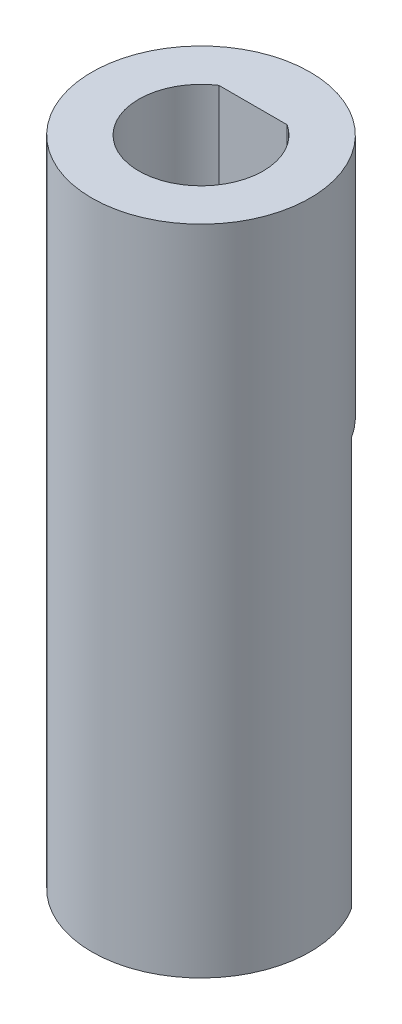
ISO-10303-21;
HEADER;
FILE_DESCRIPTION(('STEP AP214'),'2;1');
FILE_NAME('part.step','',(''),(''),'','','');
FILE_SCHEMA(('AUTOMOTIVE_DESIGN { 1 0 10303 214 1 1 1 1 }'));
ENDSEC;
DATA;
#1=APPLICATION_CONTEXT('core data for automotive mechanical design processes');
#2=APPLICATION_PROTOCOL_DEFINITION('international standard','automotive_design',2000,#1);
#3=PRODUCT_CONTEXT('',#1,'mechanical');
#4=PRODUCT('Part','Part','',(#3));
#5=PRODUCT_RELATED_PRODUCT_CATEGORY('part','',(#4));
#6=PRODUCT_DEFINITION_FORMATION('','',#4);
#7=PRODUCT_DEFINITION_CONTEXT('part definition',#1,'design');
#8=PRODUCT_DEFINITION('design','',#6,#7);
#9=PRODUCT_DEFINITION_SHAPE('','',#8);
#10=(LENGTH_UNIT() NAMED_UNIT(*) SI_UNIT(.MILLI.,.METRE.));
#11=(NAMED_UNIT(*) PLANE_ANGLE_UNIT() SI_UNIT($,.RADIAN.));
#12=(NAMED_UNIT(*) SI_UNIT($,.STERADIAN.) SOLID_ANGLE_UNIT());
#13=UNCERTAINTY_MEASURE_WITH_UNIT(LENGTH_MEASURE(1.E-05),#10,'distance_accuracy_value','');
#14=(GEOMETRIC_REPRESENTATION_CONTEXT(3) GLOBAL_UNCERTAINTY_ASSIGNED_CONTEXT((#13)) GLOBAL_UNIT_ASSIGNED_CONTEXT((#10,
#11,#12)) REPRESENTATION_CONTEXT('',''));
#15=CARTESIAN_POINT('',(0.,0.,0.));
#16=DIRECTION('',(0.,0.,1.));
#17=DIRECTION('',(1.,0.,0.));
#18=AXIS2_PLACEMENT_3D('',#15,#16,#17);
#19=CARTESIAN_POINT('',(0.,20.,0.));
#20=DIRECTION('',(0.,-1.,0.));
#21=DIRECTION('',(0.,0.,-1.));
#22=AXIS2_PLACEMENT_3D('',#19,#20,#21);
#23=CYLINDRICAL_SURFACE('',#22,2.2);
#24=CARTESIAN_POINT('',(0.,0.,0.));
#25=DIRECTION('',(0.,1.,0.));
#26=DIRECTION('',(0.,0.,1.));
#27=AXIS2_PLACEMENT_3D('',#24,#25,#26);
#28=CIRCLE('',#27,2.2);
#29=CARTESIAN_POINT('',(0.,0.,2.2));
#30=VERTEX_POINT('',#29);
#31=EDGE_CURVE('E103',#30,#30,#28,.T.);
#32=ORIENTED_EDGE('',*,*,#31,.F.);
#33=EDGE_LOOP('',(#32));
#34=FACE_BOUND('',#33,.T.);
#35=CARTESIAN_POINT('',(0.,22.,0.));
#36=DIRECTION('',(0.,1.,0.));
#37=DIRECTION('',(0.,0.,1.));
#38=AXIS2_PLACEMENT_3D('',#35,#36,#37);
#39=CIRCLE('',#38,2.2);
#40=CARTESIAN_POINT('',(0.,22.,2.2));
#41=VERTEX_POINT('',#40);
#42=EDGE_CURVE('E37',#41,#41,#39,.T.);
#43=ORIENTED_EDGE('',*,*,#42,.T.);
#44=EDGE_LOOP('',(#43));
#45=FACE_BOUND('',#44,.T.);
#46=ADVANCED_FACE('F33',(#34,#45),#23,.F.);
#47=CARTESIAN_POINT('',(0.,0.,0.));
#48=DIRECTION('',(0.,1.,0.));
#49=DIRECTION('',(0.,0.,1.));
#50=AXIS2_PLACEMENT_3D('',#47,#48,#49);
#51=PLANE('',#50);
#52=CARTESIAN_POINT('',(0.,0.,0.));
#53=DIRECTION('',(0.,1.,0.));
#54=DIRECTION('',(0.,0.,1.));
#55=AXIS2_PLACEMENT_3D('',#52,#53,#54);
#56=CIRCLE('',#55,5.35);
#57=CARTESIAN_POINT('',(-4.52769256906871,0.,-2.85));
#58=VERTEX_POINT('',#57);
#59=CARTESIAN_POINT('',(4.52769256906871,0.,-2.85));
#60=VERTEX_POINT('',#59);
#61=EDGE_CURVE('E109',#58,#60,#56,.T.);
#62=ORIENTED_EDGE('',*,*,#61,.F.);
#63=DIRECTION('',(-1.,0.,0.));
#64=VECTOR('',#63,1.);
#65=CARTESIAN_POINT('',(-4.52769256906871,0.,-2.85));
#66=LINE('',#65,#64);
#67=EDGE_CURVE('E68',#60,#58,#66,.T.);
#68=ORIENTED_EDGE('',*,*,#67,.F.);
#69=EDGE_LOOP('',(#62,#68));
#70=FACE_BOUND('',#69,.T.);
#71=ORIENTED_EDGE('',*,*,#31,.T.);
#72=EDGE_LOOP('',(#71));
#73=FACE_BOUND('',#72,.T.);
#74=ADVANCED_FACE('F117',(#70,#73),#51,.F.);
#75=CARTESIAN_POINT('',(0.,20.,0.));
#76=DIRECTION('',(0.,-1.,0.));
#77=DIRECTION('',(0.,0.,-1.));
#78=AXIS2_PLACEMENT_3D('',#75,#76,#77);
#79=CYLINDRICAL_SURFACE('',#78,5.35);
#80=ORIENTED_EDGE('',*,*,#61,.T.);
#81=DIRECTION('',(0.,-1.,0.));
#82=VECTOR('',#81,1.);
#83=CARTESIAN_POINT('',(4.52769256906871,20.,-2.85));
#84=LINE('',#83,#82);
#85=CARTESIAN_POINT('',(4.52769256906871,20.,-2.85));
#86=VERTEX_POINT('',#85);
#87=EDGE_CURVE('E11',#86,#60,#84,.T.);
#88=ORIENTED_EDGE('',*,*,#87,.F.);
#89=CARTESIAN_POINT('',(0.,20.,0.));
#90=DIRECTION('',(0.,1.,0.));
#91=DIRECTION('',(0.,0.,1.));
#92=AXIS2_PLACEMENT_3D('',#89,#90,#91);
#93=CIRCLE('',#92,5.35);
#94=CARTESIAN_POINT('',(-4.52769256906871,20.,-2.85));
#95=VERTEX_POINT('',#94);
#96=EDGE_CURVE('E104',#86,#95,#93,.T.);
#97=ORIENTED_EDGE('',*,*,#96,.T.);
#98=DIRECTION('',(0.,-1.,0.));
#99=VECTOR('',#98,1.);
#100=CARTESIAN_POINT('',(-4.52769256906871,20.,-2.85));
#101=LINE('',#100,#99);
#102=EDGE_CURVE('E42',#95,#58,#101,.T.);
#103=ORIENTED_EDGE('',*,*,#102,.T.);
#104=EDGE_LOOP('',(#80,#88,#97,#103));
#105=FACE_BOUND('',#104,.T.);
#106=CARTESIAN_POINT('',(0.,32.,0.));
#107=DIRECTION('',(0.,1.,0.));
#108=DIRECTION('',(0.,0.,1.));
#109=AXIS2_PLACEMENT_3D('',#106,#107,#108);
#110=CIRCLE('',#109,5.35);
#111=CARTESIAN_POINT('',(0.,32.,5.35));
#112=VERTEX_POINT('',#111);
#113=EDGE_CURVE('E100',#112,#112,#110,.T.);
#114=ORIENTED_EDGE('',*,*,#113,.F.);
#115=EDGE_LOOP('',(#114));
#116=FACE_BOUND('',#115,.T.);
#117=ADVANCED_FACE('F35',(#105,#116),#79,.T.);
#118=CARTESIAN_POINT('',(-4.52769256906871,20.,-2.85));
#119=DIRECTION('',(0.,0.,1.));
#120=DIRECTION('',(1.,0.,0.));
#121=AXIS2_PLACEMENT_3D('',#118,#119,#120);
#122=PLANE('',#121);
#123=ORIENTED_EDGE('',*,*,#67,.T.);
#124=ORIENTED_EDGE('',*,*,#102,.F.);
#125=DIRECTION('',(-1.,0.,0.));
#126=VECTOR('',#125,1.);
#127=CARTESIAN_POINT('',(-4.52769256906871,20.,-2.85));
#128=LINE('',#127,#126);
#129=EDGE_CURVE('E57',#86,#95,#128,.T.);
#130=ORIENTED_EDGE('',*,*,#129,.F.);
#131=ORIENTED_EDGE('',*,*,#87,.T.);
#132=EDGE_LOOP('',(#123,#124,#130,#131));
#133=FACE_BOUND('',#132,.T.);
#134=ADVANCED_FACE('F144',(#133),#122,.F.);
#135=CARTESIAN_POINT('',(0.,20.,0.));
#136=DIRECTION('',(0.,1.,0.));
#137=DIRECTION('',(0.,0.,1.));
#138=AXIS2_PLACEMENT_3D('',#135,#136,#137);
#139=PLANE('',#138);
#140=ORIENTED_EDGE('',*,*,#96,.F.);
#141=ORIENTED_EDGE('',*,*,#129,.T.);
#142=EDGE_LOOP('',(#140,#141));
#143=FACE_BOUND('',#142,.T.);
#144=ADVANCED_FACE('F142',(#143),#139,.F.);
#145=CARTESIAN_POINT('',(0.,32.,0.));
#146=DIRECTION('',(0.,1.,0.));
#147=DIRECTION('',(0.,0.,1.));
#148=AXIS2_PLACEMENT_3D('',#145,#146,#147);
#149=PLANE('',#148);
#150=CARTESIAN_POINT('',(0.,32.,0.));
#151=DIRECTION('',(0.,1.,0.));
#152=DIRECTION('',(0.,0.,1.));
#153=AXIS2_PLACEMENT_3D('',#150,#151,#152);
#154=CIRCLE('',#153,3.05);
#155=CARTESIAN_POINT('',(-1.67332005306815,32.,-2.55));
#156=VERTEX_POINT('',#155);
#157=CARTESIAN_POINT('',(1.67332005306815,32.,-2.55));
#158=VERTEX_POINT('',#157);
#159=EDGE_CURVE('E49',#156,#158,#154,.T.);
#160=ORIENTED_EDGE('',*,*,#159,.F.);
#161=DIRECTION('',(-1.,0.,0.));
#162=VECTOR('',#161,1.);
#163=CARTESIAN_POINT('',(-1.67332005306815,32.,-2.55));
#164=LINE('',#163,#162);
#165=EDGE_CURVE('E88',#158,#156,#164,.T.);
#166=ORIENTED_EDGE('',*,*,#165,.F.);
#167=EDGE_LOOP('',(#160,#166));
#168=FACE_BOUND('',#167,.T.);
#169=ORIENTED_EDGE('',*,*,#113,.T.);
#170=EDGE_LOOP('',(#169));
#171=FACE_BOUND('',#170,.T.);
#172=ADVANCED_FACE('F92',(#168,#171),#149,.T.);
#173=CARTESIAN_POINT('',(0.,22.,0.));
#174=DIRECTION('',(0.,1.,0.));
#175=DIRECTION('',(0.,0.,1.));
#176=AXIS2_PLACEMENT_3D('',#173,#174,#175);
#177=CYLINDRICAL_SURFACE('',#176,3.05);
#178=ORIENTED_EDGE('',*,*,#159,.T.);
#179=DIRECTION('',(0.,1.,0.));
#180=VECTOR('',#179,1.);
#181=CARTESIAN_POINT('',(1.67332005306815,22.,-2.55));
#182=LINE('',#181,#180);
#183=CARTESIAN_POINT('',(1.67332005306815,22.,-2.55));
#184=VERTEX_POINT('',#183);
#185=EDGE_CURVE('E85',#184,#158,#182,.T.);
#186=ORIENTED_EDGE('',*,*,#185,.F.);
#187=CARTESIAN_POINT('',(0.,22.,0.));
#188=DIRECTION('',(0.,1.,0.));
#189=DIRECTION('',(0.,0.,1.));
#190=AXIS2_PLACEMENT_3D('',#187,#188,#189);
#191=CIRCLE('',#190,3.05);
#192=CARTESIAN_POINT('',(-1.67332005306815,22.,-2.55));
#193=VERTEX_POINT('',#192);
#194=EDGE_CURVE('E83',#193,#184,#191,.T.);
#195=ORIENTED_EDGE('',*,*,#194,.F.);
#196=DIRECTION('',(0.,1.,0.));
#197=VECTOR('',#196,1.);
#198=CARTESIAN_POINT('',(-1.67332005306815,22.,-2.55));
#199=LINE('',#198,#197);
#200=EDGE_CURVE('E77',#193,#156,#199,.T.);
#201=ORIENTED_EDGE('',*,*,#200,.T.);
#202=EDGE_LOOP('',(#178,#186,#195,#201));
#203=FACE_BOUND('',#202,.T.);
#204=ADVANCED_FACE('F81',(#203),#177,.F.);
#205=CARTESIAN_POINT('',(-1.67332005306815,22.,-2.55));
#206=DIRECTION('',(0.,0.,-1.));
#207=DIRECTION('',(-1.,0.,0.));
#208=AXIS2_PLACEMENT_3D('',#205,#206,#207);
#209=PLANE('',#208);
#210=ORIENTED_EDGE('',*,*,#165,.T.);
#211=ORIENTED_EDGE('',*,*,#200,.F.);
#212=DIRECTION('',(-1.,0.,0.));
#213=VECTOR('',#212,1.);
#214=CARTESIAN_POINT('',(-1.67332005306815,22.,-2.55));
#215=LINE('',#214,#213);
#216=EDGE_CURVE('E96',#184,#193,#215,.T.);
#217=ORIENTED_EDGE('',*,*,#216,.F.);
#218=ORIENTED_EDGE('',*,*,#185,.T.);
#219=EDGE_LOOP('',(#210,#211,#217,#218));
#220=FACE_BOUND('',#219,.T.);
#221=ADVANCED_FACE('F89',(#220),#209,.F.);
#222=CARTESIAN_POINT('',(0.,22.,0.));
#223=DIRECTION('',(0.,1.,0.));
#224=DIRECTION('',(0.,0.,1.));
#225=AXIS2_PLACEMENT_3D('',#222,#223,#224);
#226=PLANE('',#225);
#227=ORIENTED_EDGE('',*,*,#42,.F.);
#228=EDGE_LOOP('',(#227));
#229=FACE_BOUND('',#228,.T.);
#230=ORIENTED_EDGE('',*,*,#194,.T.);
#231=ORIENTED_EDGE('',*,*,#216,.T.);
#232=EDGE_LOOP('',(#230,#231));
#233=FACE_BOUND('',#232,.T.);
#234=ADVANCED_FACE('F129',(#229,#233),#226,.T.);
#235=CLOSED_SHELL('',(#46,#74,#117,#134,#144,#172,#204,#221,#234));
#236=MANIFOLD_SOLID_BREP('B2',#235);
#237=ADVANCED_BREP_SHAPE_REPRESENTATION('',(#18,#236),#14);
#238=SHAPE_DEFINITION_REPRESENTATION(#9,#237);
ENDSEC;
END-ISO-10303-21;
